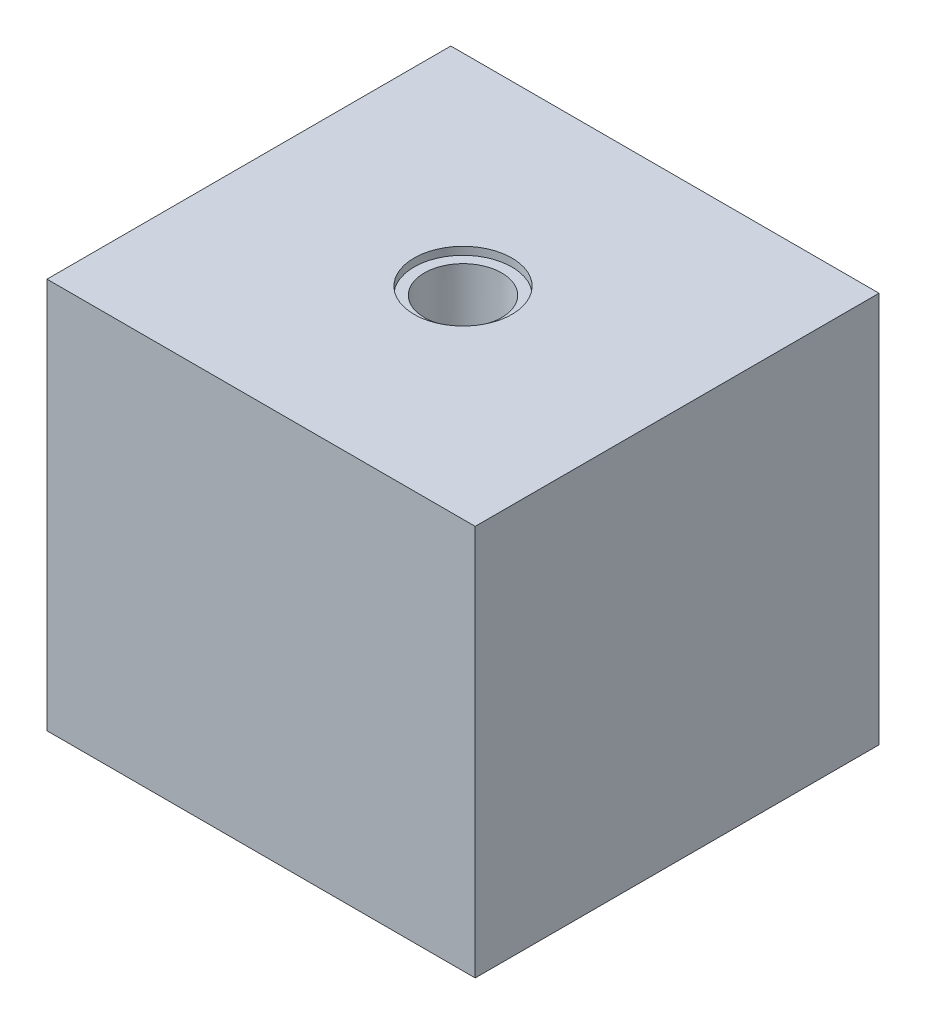
ISO-10303-21;
HEADER;
FILE_DESCRIPTION(('STEP AP214'),'2;1');
FILE_NAME('part.step','',(''),(''),'','','');
FILE_SCHEMA(('AUTOMOTIVE_DESIGN { 1 0 10303 214 1 1 1 1 }'));
ENDSEC;
DATA;
#1=APPLICATION_CONTEXT('core data for automotive mechanical design processes');
#2=APPLICATION_PROTOCOL_DEFINITION('international standard','automotive_design',2000,#1);
#3=PRODUCT_CONTEXT('',#1,'mechanical');
#4=PRODUCT('Part','Part','',(#3));
#5=PRODUCT_RELATED_PRODUCT_CATEGORY('part','',(#4));
#6=PRODUCT_DEFINITION_FORMATION('','',#4);
#7=PRODUCT_DEFINITION_CONTEXT('part definition',#1,'design');
#8=PRODUCT_DEFINITION('design','',#6,#7);
#9=PRODUCT_DEFINITION_SHAPE('','',#8);
#10=(LENGTH_UNIT() NAMED_UNIT(*) SI_UNIT(.MILLI.,.METRE.));
#11=(NAMED_UNIT(*) PLANE_ANGLE_UNIT() SI_UNIT($,.RADIAN.));
#12=(NAMED_UNIT(*) SI_UNIT($,.STERADIAN.) SOLID_ANGLE_UNIT());
#13=UNCERTAINTY_MEASURE_WITH_UNIT(LENGTH_MEASURE(1.E-05),#10,'distance_accuracy_value','');
#14=(GEOMETRIC_REPRESENTATION_CONTEXT(3) GLOBAL_UNCERTAINTY_ASSIGNED_CONTEXT((#13)) GLOBAL_UNIT_ASSIGNED_CONTEXT((#10,
#11,#12)) REPRESENTATION_CONTEXT('',''));
#15=CARTESIAN_POINT('',(0.,0.,0.));
#16=DIRECTION('',(0.,0.,1.));
#17=DIRECTION('',(1.,0.,0.));
#18=AXIS2_PLACEMENT_3D('',#15,#16,#17);
#19=CARTESIAN_POINT('',(-54.737656276046,100.,51.6214035672612));
#20=DIRECTION('',(1.,0.,0.));
#21=DIRECTION('',(0.,0.,-1.));
#22=AXIS2_PLACEMENT_3D('',#19,#20,#21);
#23=PLANE('',#22);
#24=DIRECTION('',(0.,0.,1.));
#25=VECTOR('',#24,1.);
#26=CARTESIAN_POINT('',(-54.737656276046,0.,51.6214035672612));
#27=LINE('',#26,#25);
#28=CARTESIAN_POINT('',(-54.737656276046,0.,-51.6214035672612));
#29=VERTEX_POINT('',#28);
#30=CARTESIAN_POINT('',(-54.737656276046,0.,51.6214035672612));
#31=VERTEX_POINT('',#30);
#32=EDGE_CURVE('E108',#29,#31,#27,.T.);
#33=ORIENTED_EDGE('',*,*,#32,.T.);
#34=DIRECTION('',(0.,-1.,0.));
#35=VECTOR('',#34,1.);
#36=CARTESIAN_POINT('',(-54.737656276046,100.,51.6214035672612));
#37=LINE('',#36,#35);
#38=CARTESIAN_POINT('',(-54.737656276046,100.,51.6214035672612));
#39=VERTEX_POINT('',#38);
#40=EDGE_CURVE('E11',#39,#31,#37,.T.);
#41=ORIENTED_EDGE('',*,*,#40,.F.);
#42=DIRECTION('',(0.,0.,1.));
#43=VECTOR('',#42,1.);
#44=CARTESIAN_POINT('',(-54.737656276046,100.,51.6214035672612));
#45=LINE('',#44,#43);
#46=CARTESIAN_POINT('',(-54.737656276046,100.,-51.6214035672612));
#47=VERTEX_POINT('',#46);
#48=EDGE_CURVE('E96',#47,#39,#45,.T.);
#49=ORIENTED_EDGE('',*,*,#48,.F.);
#50=DIRECTION('',(0.,-1.,0.));
#51=VECTOR('',#50,1.);
#52=CARTESIAN_POINT('',(-54.737656276046,100.,-51.6214035672612));
#53=LINE('',#52,#51);
#54=EDGE_CURVE('E104',#47,#29,#53,.T.);
#55=ORIENTED_EDGE('',*,*,#54,.T.);
#56=EDGE_LOOP('',(#33,#41,#49,#55));
#57=FACE_BOUND('',#56,.T.);
#58=ADVANCED_FACE('F45',(#57),#23,.F.);
#59=CARTESIAN_POINT('',(54.737656276046,100.,51.6214035672612));
#60=DIRECTION('',(0.,0.,-1.));
#61=DIRECTION('',(-1.,0.,0.));
#62=AXIS2_PLACEMENT_3D('',#59,#60,#61);
#63=PLANE('',#62);
#64=DIRECTION('',(1.,0.,0.));
#65=VECTOR('',#64,1.);
#66=CARTESIAN_POINT('',(54.737656276046,0.,51.6214035672612));
#67=LINE('',#66,#65);
#68=CARTESIAN_POINT('',(54.737656276046,0.,51.6214035672612));
#69=VERTEX_POINT('',#68);
#70=EDGE_CURVE('E100',#31,#69,#67,.T.);
#71=ORIENTED_EDGE('',*,*,#70,.T.);
#72=DIRECTION('',(0.,-1.,0.));
#73=VECTOR('',#72,1.);
#74=CARTESIAN_POINT('',(54.737656276046,100.,51.6214035672612));
#75=LINE('',#74,#73);
#76=CARTESIAN_POINT('',(54.737656276046,100.,51.6214035672612));
#77=VERTEX_POINT('',#76);
#78=EDGE_CURVE('E53',#77,#69,#75,.T.);
#79=ORIENTED_EDGE('',*,*,#78,.F.);
#80=DIRECTION('',(1.,0.,0.));
#81=VECTOR('',#80,1.);
#82=CARTESIAN_POINT('',(54.737656276046,100.,51.6214035672612));
#83=LINE('',#82,#81);
#84=EDGE_CURVE('E91',#39,#77,#83,.T.);
#85=ORIENTED_EDGE('',*,*,#84,.F.);
#86=ORIENTED_EDGE('',*,*,#40,.T.);
#87=EDGE_LOOP('',(#71,#79,#85,#86));
#88=FACE_BOUND('',#87,.T.);
#89=ADVANCED_FACE('F99',(#88),#63,.F.);
#90=CARTESIAN_POINT('',(54.737656276046,100.,51.6214035672612));
#91=DIRECTION('',(-1.,0.,0.));
#92=DIRECTION('',(0.,0.,1.));
#93=AXIS2_PLACEMENT_3D('',#90,#91,#92);
#94=PLANE('',#93);
#95=DIRECTION('',(0.,0.,-1.));
#96=VECTOR('',#95,1.);
#97=CARTESIAN_POINT('',(54.737656276046,0.,51.6214035672612));
#98=LINE('',#97,#96);
#99=CARTESIAN_POINT('',(54.737656276046,0.,-51.6214035672612));
#100=VERTEX_POINT('',#99);
#101=EDGE_CURVE('E78',#69,#100,#98,.T.);
#102=ORIENTED_EDGE('',*,*,#101,.T.);
#103=DIRECTION('',(0.,-1.,0.));
#104=VECTOR('',#103,1.);
#105=CARTESIAN_POINT('',(54.737656276046,100.,-51.6214035672612));
#106=LINE('',#105,#104);
#107=CARTESIAN_POINT('',(54.737656276046,100.,-51.6214035672612));
#108=VERTEX_POINT('',#107);
#109=EDGE_CURVE('E101',#108,#100,#106,.T.);
#110=ORIENTED_EDGE('',*,*,#109,.F.);
#111=DIRECTION('',(0.,0.,-1.));
#112=VECTOR('',#111,1.);
#113=CARTESIAN_POINT('',(54.737656276046,100.,51.6214035672612));
#114=LINE('',#113,#112);
#115=EDGE_CURVE('E94',#77,#108,#114,.T.);
#116=ORIENTED_EDGE('',*,*,#115,.F.);
#117=ORIENTED_EDGE('',*,*,#78,.T.);
#118=EDGE_LOOP('',(#102,#110,#116,#117));
#119=FACE_BOUND('',#118,.T.);
#120=ADVANCED_FACE('F102',(#119),#94,.F.);
#121=CARTESIAN_POINT('',(54.737656276046,100.,-51.6214035672612));
#122=DIRECTION('',(0.,0.,1.));
#123=DIRECTION('',(1.,0.,0.));
#124=AXIS2_PLACEMENT_3D('',#121,#122,#123);
#125=PLANE('',#124);
#126=DIRECTION('',(-1.,0.,0.));
#127=VECTOR('',#126,1.);
#128=CARTESIAN_POINT('',(54.737656276046,0.,-51.6214035672612));
#129=LINE('',#128,#127);
#130=EDGE_CURVE('E84',#100,#29,#129,.T.);
#131=ORIENTED_EDGE('',*,*,#130,.T.);
#132=ORIENTED_EDGE('',*,*,#54,.F.);
#133=DIRECTION('',(-1.,0.,0.));
#134=VECTOR('',#133,1.);
#135=CARTESIAN_POINT('',(54.737656276046,100.,-51.6214035672612));
#136=LINE('',#135,#134);
#137=EDGE_CURVE('E61',#108,#47,#136,.T.);
#138=ORIENTED_EDGE('',*,*,#137,.F.);
#139=ORIENTED_EDGE('',*,*,#109,.T.);
#140=EDGE_LOOP('',(#131,#132,#138,#139));
#141=FACE_BOUND('',#140,.T.);
#142=ADVANCED_FACE('F116',(#141),#125,.F.);
#143=CARTESIAN_POINT('',(0.,100.,0.));
#144=DIRECTION('',(0.,1.,0.));
#145=DIRECTION('',(0.,0.,1.));
#146=AXIS2_PLACEMENT_3D('',#143,#144,#145);
#147=PLANE('',#146);
#148=CARTESIAN_POINT('',(0.,100.,0.));
#149=DIRECTION('',(0.,1.,0.));
#150=DIRECTION('',(0.,0.,1.));
#151=AXIS2_PLACEMENT_3D('',#148,#149,#150);
#152=CIRCLE('',#151,12.5);
#153=CARTESIAN_POINT('',(0.,100.,12.5));
#154=VERTEX_POINT('',#153);
#155=EDGE_CURVE('E111',#154,#154,#152,.T.);
#156=ORIENTED_EDGE('',*,*,#155,.F.);
#157=EDGE_LOOP('',(#156));
#158=FACE_BOUND('',#157,.T.);
#159=ORIENTED_EDGE('',*,*,#48,.T.);
#160=ORIENTED_EDGE('',*,*,#84,.T.);
#161=ORIENTED_EDGE('',*,*,#115,.T.);
#162=ORIENTED_EDGE('',*,*,#137,.T.);
#163=EDGE_LOOP('',(#159,#160,#161,#162));
#164=FACE_BOUND('',#163,.T.);
#165=ADVANCED_FACE('F92',(#158,#164),#147,.T.);
#166=CARTESIAN_POINT('',(0.,0.,0.));
#167=DIRECTION('',(0.,1.,0.));
#168=DIRECTION('',(0.,0.,1.));
#169=AXIS2_PLACEMENT_3D('',#166,#167,#168);
#170=PLANE('',#169);
#171=CARTESIAN_POINT('',(0.,0.,0.));
#172=DIRECTION('',(0.,1.,0.));
#173=DIRECTION('',(0.,0.,1.));
#174=AXIS2_PLACEMENT_3D('',#171,#172,#173);
#175=CIRCLE('',#174,6.);
#176=CARTESIAN_POINT('',(0.,0.,6.));
#177=VERTEX_POINT('',#176);
#178=EDGE_CURVE('E136',#177,#177,#175,.T.);
#179=ORIENTED_EDGE('',*,*,#178,.T.);
#180=EDGE_LOOP('',(#179));
#181=FACE_BOUND('',#180,.T.);
#182=ORIENTED_EDGE('',*,*,#32,.F.);
#183=ORIENTED_EDGE('',*,*,#130,.F.);
#184=ORIENTED_EDGE('',*,*,#101,.F.);
#185=ORIENTED_EDGE('',*,*,#70,.F.);
#186=EDGE_LOOP('',(#182,#183,#184,#185));
#187=FACE_BOUND('',#186,.T.);
#188=ADVANCED_FACE('F119',(#181,#187),#170,.F.);
#189=CARTESIAN_POINT('',(0.,100.,0.));
#190=DIRECTION('',(0.,1.,0.));
#191=DIRECTION('',(0.,0.,1.));
#192=AXIS2_PLACEMENT_3D('',#189,#190,#191);
#193=CYLINDRICAL_SURFACE('',#192,12.5);
#194=CARTESIAN_POINT('',(0.,98.,0.));
#195=DIRECTION('',(0.,1.,0.));
#196=DIRECTION('',(0.,0.,1.));
#197=AXIS2_PLACEMENT_3D('',#194,#195,#196);
#198=CIRCLE('',#197,12.5);
#199=CARTESIAN_POINT('',(0.,98.,12.5));
#200=VERTEX_POINT('',#199);
#201=EDGE_CURVE('E124',#200,#200,#198,.T.);
#202=ORIENTED_EDGE('',*,*,#201,.F.);
#203=EDGE_LOOP('',(#202));
#204=FACE_BOUND('',#203,.T.);
#205=ORIENTED_EDGE('',*,*,#155,.T.);
#206=EDGE_LOOP('',(#205));
#207=FACE_BOUND('',#206,.T.);
#208=ADVANCED_FACE('F162',(#204,#207),#193,.F.);
#209=CARTESIAN_POINT('',(12.5,98.,0.));
#210=DIRECTION('',(0.,-1.,0.));
#211=DIRECTION('',(0.,0.,-1.));
#212=AXIS2_PLACEMENT_3D('',#209,#210,#211);
#213=PLANE('',#212);
#214=CARTESIAN_POINT('',(0.,98.,0.));
#215=DIRECTION('',(0.,1.,0.));
#216=DIRECTION('',(0.,0.,1.));
#217=AXIS2_PLACEMENT_3D('',#214,#215,#216);
#218=CIRCLE('',#217,9.8965);
#219=CARTESIAN_POINT('',(0.,98.,9.8965));
#220=VERTEX_POINT('',#219);
#221=EDGE_CURVE('E127',#220,#220,#218,.T.);
#222=ORIENTED_EDGE('',*,*,#221,.F.);
#223=EDGE_LOOP('',(#222));
#224=FACE_BOUND('',#223,.T.);
#225=ORIENTED_EDGE('',*,*,#201,.T.);
#226=EDGE_LOOP('',(#225));
#227=FACE_BOUND('',#226,.T.);
#228=ADVANCED_FACE('F156',(#224,#227),#213,.F.);
#229=CARTESIAN_POINT('',(0.,98.,0.));
#230=DIRECTION('',(0.,1.,0.));
#231=DIRECTION('',(0.,0.,1.));
#232=AXIS2_PLACEMENT_3D('',#229,#230,#231);
#233=CONICAL_SURFACE('',#232,9.8965,0.0312064870256586);
#234=CARTESIAN_POINT('',(0.,83.,0.));
#235=DIRECTION('',(0.,1.,0.));
#236=DIRECTION('',(0.,0.,1.));
#237=AXIS2_PLACEMENT_3D('',#234,#235,#236);
#238=CIRCLE('',#237,9.4282506840203);
#239=CARTESIAN_POINT('',(0.,83.,9.4282506840203));
#240=VERTEX_POINT('',#239);
#241=EDGE_CURVE('E130',#240,#240,#238,.T.);
#242=ORIENTED_EDGE('',*,*,#241,.F.);
#243=EDGE_LOOP('',(#242));
#244=FACE_BOUND('',#243,.T.);
#245=ORIENTED_EDGE('',*,*,#221,.T.);
#246=EDGE_LOOP('',(#245));
#247=FACE_BOUND('',#246,.T.);
#248=ADVANCED_FACE('F150',(#244,#247),#233,.F.);
#249=CARTESIAN_POINT('',(9.4282506840203,83.,0.));
#250=DIRECTION('',(0.,-1.,0.));
#251=DIRECTION('',(0.,0.,-1.));
#252=AXIS2_PLACEMENT_3D('',#249,#250,#251);
#253=PLANE('',#252);
#254=CARTESIAN_POINT('',(0.,83.,0.));
#255=DIRECTION('',(0.,1.,0.));
#256=DIRECTION('',(0.,0.,1.));
#257=AXIS2_PLACEMENT_3D('',#254,#255,#256);
#258=CIRCLE('',#257,6.);
#259=CARTESIAN_POINT('',(0.,83.,6.));
#260=VERTEX_POINT('',#259);
#261=EDGE_CURVE('E133',#260,#260,#258,.T.);
#262=ORIENTED_EDGE('',*,*,#261,.F.);
#263=EDGE_LOOP('',(#262));
#264=FACE_BOUND('',#263,.T.);
#265=ORIENTED_EDGE('',*,*,#241,.T.);
#266=EDGE_LOOP('',(#265));
#267=FACE_BOUND('',#266,.T.);
#268=ADVANCED_FACE('F144',(#264,#267),#253,.F.);
#269=CARTESIAN_POINT('',(0.,100.,0.));
#270=DIRECTION('',(0.,1.,0.));
#271=DIRECTION('',(0.,0.,1.));
#272=AXIS2_PLACEMENT_3D('',#269,#270,#271);
#273=CYLINDRICAL_SURFACE('',#272,6.);
#274=ORIENTED_EDGE('',*,*,#178,.F.);
#275=EDGE_LOOP('',(#274));
#276=FACE_BOUND('',#275,.T.);
#277=ORIENTED_EDGE('',*,*,#261,.T.);
#278=EDGE_LOOP('',(#277));
#279=FACE_BOUND('',#278,.T.);
#280=ADVANCED_FACE('F141',(#276,#279),#273,.F.);
#281=CLOSED_SHELL('',(#58,#89,#120,#142,#165,#188,#208,#228,#248,#268,#280));
#282=MANIFOLD_SOLID_BREP('B2',#281);
#283=ADVANCED_BREP_SHAPE_REPRESENTATION('',(#18,#282),#14);
#284=SHAPE_DEFINITION_REPRESENTATION(#9,#283);
ENDSEC;
END-ISO-10303-21;
